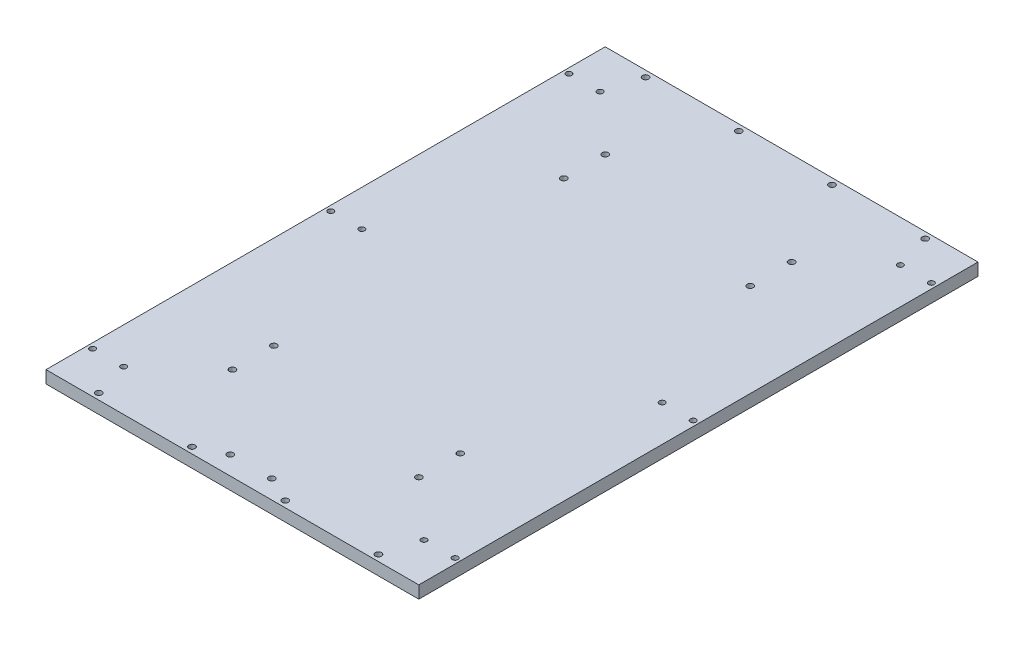
ISO-10303-21;
HEADER;
FILE_DESCRIPTION(('STEP AP214'),'2;1');
FILE_NAME('part.step','',(''),(''),'','','');
FILE_SCHEMA(('AUTOMOTIVE_DESIGN { 1 0 10303 214 1 1 1 1 }'));
ENDSEC;
DATA;
#1=APPLICATION_CONTEXT('core data for automotive mechanical design processes');
#2=APPLICATION_PROTOCOL_DEFINITION('international standard','automotive_design',2000,#1);
#3=PRODUCT_CONTEXT('',#1,'mechanical');
#4=PRODUCT('Part','Part','',(#3));
#5=PRODUCT_RELATED_PRODUCT_CATEGORY('part','',(#4));
#6=PRODUCT_DEFINITION_FORMATION('','',#4);
#7=PRODUCT_DEFINITION_CONTEXT('part definition',#1,'design');
#8=PRODUCT_DEFINITION('design','',#6,#7);
#9=PRODUCT_DEFINITION_SHAPE('','',#8);
#10=(LENGTH_UNIT() NAMED_UNIT(*) SI_UNIT(.MILLI.,.METRE.));
#11=(NAMED_UNIT(*) PLANE_ANGLE_UNIT() SI_UNIT($,.RADIAN.));
#12=(NAMED_UNIT(*) SI_UNIT($,.STERADIAN.) SOLID_ANGLE_UNIT());
#13=UNCERTAINTY_MEASURE_WITH_UNIT(LENGTH_MEASURE(1.E-05),#10,'distance_accuracy_value','');
#14=(GEOMETRIC_REPRESENTATION_CONTEXT(3) GLOBAL_UNCERTAINTY_ASSIGNED_CONTEXT((#13)) GLOBAL_UNIT_ASSIGNED_CONTEXT((#10,
#11,#12)) REPRESENTATION_CONTEXT('',''));
#15=CARTESIAN_POINT('',(0.,0.,0.));
#16=DIRECTION('',(0.,0.,1.));
#17=DIRECTION('',(1.,0.,0.));
#18=AXIS2_PLACEMENT_3D('',#15,#16,#17);
#19=CARTESIAN_POINT('',(180.,12.,-270.));
#20=DIRECTION('',(0.,-1.,0.));
#21=DIRECTION('',(0.,0.,-1.));
#22=AXIS2_PLACEMENT_3D('',#19,#20,#21);
#23=PLANE('',#22);
#24=CARTESIAN_POINT('',(90.,12.,-180.));
#25=DIRECTION('',(0.,-1.,0.));
#26=DIRECTION('',(0.,0.,1.));
#27=AXIS2_PLACEMENT_3D('',#24,#25,#26);
#28=CIRCLE('',#27,3.00000000000001);
#29=CARTESIAN_POINT('',(90.,12.,-177.));
#30=VERTEX_POINT('',#29);
#31=EDGE_CURVE('E168',#30,#30,#28,.T.);
#32=ORIENTED_EDGE('',*,*,#31,.T.);
#33=EDGE_LOOP('',(#32));
#34=FACE_BOUND('',#33,.T.);
#35=CARTESIAN_POINT('',(90.,12.,140.));
#36=DIRECTION('',(0.,1.,0.));
#37=DIRECTION('',(0.,0.,-1.));
#38=AXIS2_PLACEMENT_3D('',#35,#36,#37);
#39=CIRCLE('',#38,3.00000000000001);
#40=CARTESIAN_POINT('',(90.,12.,137.));
#41=VERTEX_POINT('',#40);
#42=EDGE_CURVE('E177',#41,#41,#39,.T.);
#43=ORIENTED_EDGE('',*,*,#42,.F.);
#44=EDGE_LOOP('',(#43));
#45=FACE_BOUND('',#44,.T.);
#46=CARTESIAN_POINT('',(90.,12.,180.));
#47=DIRECTION('',(0.,1.,0.));
#48=DIRECTION('',(0.,0.,-1.));
#49=AXIS2_PLACEMENT_3D('',#46,#47,#48);
#50=CIRCLE('',#49,3.00000000000001);
#51=CARTESIAN_POINT('',(90.,12.,177.));
#52=VERTEX_POINT('',#51);
#53=EDGE_CURVE('E183',#52,#52,#50,.T.);
#54=ORIENTED_EDGE('',*,*,#53,.F.);
#55=EDGE_LOOP('',(#54));
#56=FACE_BOUND('',#55,.T.);
#57=CARTESIAN_POINT('',(-90.,12.,180.));
#58=DIRECTION('',(0.,-1.,0.));
#59=DIRECTION('',(0.,0.,-1.));
#60=AXIS2_PLACEMENT_3D('',#57,#58,#59);
#61=CIRCLE('',#60,3.00000000000001);
#62=CARTESIAN_POINT('',(-90.,12.,177.));
#63=VERTEX_POINT('',#62);
#64=EDGE_CURVE('E192',#63,#63,#61,.T.);
#65=ORIENTED_EDGE('',*,*,#64,.T.);
#66=EDGE_LOOP('',(#65));
#67=FACE_BOUND('',#66,.T.);
#68=CARTESIAN_POINT('',(-90.,12.,-140.));
#69=DIRECTION('',(0.,1.,0.));
#70=DIRECTION('',(0.,0.,1.));
#71=AXIS2_PLACEMENT_3D('',#68,#69,#70);
#72=CIRCLE('',#71,3.00000000000001);
#73=CARTESIAN_POINT('',(-90.,12.,-137.));
#74=VERTEX_POINT('',#73);
#75=EDGE_CURVE('E199',#74,#74,#72,.T.);
#76=ORIENTED_EDGE('',*,*,#75,.F.);
#77=EDGE_LOOP('',(#76));
#78=FACE_BOUND('',#77,.T.);
#79=CARTESIAN_POINT('',(-90.,12.,-180.));
#80=DIRECTION('',(0.,1.,0.));
#81=DIRECTION('',(0.,0.,1.));
#82=AXIS2_PLACEMENT_3D('',#79,#80,#81);
#83=CIRCLE('',#82,3.00000000000001);
#84=CARTESIAN_POINT('',(-90.,12.,-177.));
#85=VERTEX_POINT('',#84);
#86=EDGE_CURVE('E205',#85,#85,#83,.T.);
#87=ORIENTED_EDGE('',*,*,#86,.F.);
#88=EDGE_LOOP('',(#87));
#89=FACE_BOUND('',#88,.T.);
#90=CARTESIAN_POINT('',(175.,12.,230.));
#91=DIRECTION('',(0.,-1.,0.));
#92=DIRECTION('',(0.,0.,1.));
#93=AXIS2_PLACEMENT_3D('',#90,#91,#92);
#94=CIRCLE('',#93,2.75000000000001);
#95=CARTESIAN_POINT('',(175.,12.,232.75));
#96=VERTEX_POINT('',#95);
#97=EDGE_CURVE('E214',#96,#96,#94,.T.);
#98=ORIENTED_EDGE('',*,*,#97,.T.);
#99=EDGE_LOOP('',(#98));
#100=FACE_BOUND('',#99,.T.);
#101=CARTESIAN_POINT('',(175.,12.,0.));
#102=DIRECTION('',(0.,-1.,0.));
#103=DIRECTION('',(0.,0.,1.));
#104=AXIS2_PLACEMENT_3D('',#101,#102,#103);
#105=CIRCLE('',#104,2.75000000000001);
#106=CARTESIAN_POINT('',(175.,12.,2.75000000000001));
#107=VERTEX_POINT('',#106);
#108=EDGE_CURVE('E224',#107,#107,#105,.T.);
#109=ORIENTED_EDGE('',*,*,#108,.T.);
#110=EDGE_LOOP('',(#109));
#111=FACE_BOUND('',#110,.T.);
#112=CARTESIAN_POINT('',(175.,12.,-230.));
#113=DIRECTION('',(0.,-1.,0.));
#114=DIRECTION('',(0.,0.,1.));
#115=AXIS2_PLACEMENT_3D('',#112,#113,#114);
#116=CIRCLE('',#115,2.75000000000001);
#117=CARTESIAN_POINT('',(175.,12.,-227.25));
#118=VERTEX_POINT('',#117);
#119=EDGE_CURVE('E234',#118,#118,#116,.T.);
#120=ORIENTED_EDGE('',*,*,#119,.T.);
#121=EDGE_LOOP('',(#120));
#122=FACE_BOUND('',#121,.T.);
#123=CARTESIAN_POINT('',(-175.,12.,0.));
#124=DIRECTION('',(0.,1.,0.));
#125=DIRECTION('',(0.,0.,1.));
#126=AXIS2_PLACEMENT_3D('',#123,#124,#125);
#127=CIRCLE('',#126,2.75000000000001);
#128=CARTESIAN_POINT('',(-175.,12.,2.75000000000001));
#129=VERTEX_POINT('',#128);
#130=EDGE_CURVE('E243',#129,#129,#127,.T.);
#131=ORIENTED_EDGE('',*,*,#130,.F.);
#132=EDGE_LOOP('',(#131));
#133=FACE_BOUND('',#132,.T.);
#134=CARTESIAN_POINT('',(-145.,12.,0.));
#135=DIRECTION('',(0.,1.,0.));
#136=DIRECTION('',(0.,0.,1.));
#137=AXIS2_PLACEMENT_3D('',#134,#135,#136);
#138=CIRCLE('',#137,2.75000000000001);
#139=CARTESIAN_POINT('',(-145.,12.,2.75000000000001));
#140=VERTEX_POINT('',#139);
#141=EDGE_CURVE('E249',#140,#140,#138,.T.);
#142=ORIENTED_EDGE('',*,*,#141,.F.);
#143=EDGE_LOOP('',(#142));
#144=FACE_BOUND('',#143,.T.);
#145=CARTESIAN_POINT('',(-145.,12.,-230.));
#146=DIRECTION('',(0.,1.,0.));
#147=DIRECTION('',(0.,0.,1.));
#148=AXIS2_PLACEMENT_3D('',#145,#146,#147);
#149=CIRCLE('',#148,2.75000000000001);
#150=CARTESIAN_POINT('',(-145.,12.,-227.25));
#151=VERTEX_POINT('',#150);
#152=EDGE_CURVE('E253',#151,#151,#149,.T.);
#153=ORIENTED_EDGE('',*,*,#152,.F.);
#154=EDGE_LOOP('',(#153));
#155=FACE_BOUND('',#154,.T.);
#156=CARTESIAN_POINT('',(-175.,12.,-230.));
#157=DIRECTION('',(0.,1.,0.));
#158=DIRECTION('',(0.,0.,1.));
#159=AXIS2_PLACEMENT_3D('',#156,#157,#158);
#160=CIRCLE('',#159,2.75000000000001);
#161=CARTESIAN_POINT('',(-175.,12.,-227.25));
#162=VERTEX_POINT('',#161);
#163=EDGE_CURVE('E259',#162,#162,#160,.T.);
#164=ORIENTED_EDGE('',*,*,#163,.F.);
#165=EDGE_LOOP('',(#164));
#166=FACE_BOUND('',#165,.T.);
#167=CARTESIAN_POINT('',(-45.,12.,-264.));
#168=DIRECTION('',(0.,-1.,0.));
#169=DIRECTION('',(0.,0.,-1.));
#170=AXIS2_PLACEMENT_3D('',#167,#168,#169);
#171=CIRCLE('',#170,2.99999999999999);
#172=CARTESIAN_POINT('',(-45.,12.,-267.));
#173=VERTEX_POINT('',#172);
#174=EDGE_CURVE('E268',#173,#173,#171,.T.);
#175=ORIENTED_EDGE('',*,*,#174,.T.);
#176=EDGE_LOOP('',(#175));
#177=FACE_BOUND('',#176,.T.);
#178=CARTESIAN_POINT('',(135.,12.,-264.));
#179=DIRECTION('',(0.,-1.,0.));
#180=DIRECTION('',(0.,0.,-1.));
#181=AXIS2_PLACEMENT_3D('',#178,#179,#180);
#182=CIRCLE('',#181,2.99999999999999);
#183=CARTESIAN_POINT('',(135.,12.,-267.));
#184=VERTEX_POINT('',#183);
#185=EDGE_CURVE('E280',#184,#184,#182,.T.);
#186=ORIENTED_EDGE('',*,*,#185,.T.);
#187=EDGE_LOOP('',(#186));
#188=FACE_BOUND('',#187,.T.);
#189=CARTESIAN_POINT('',(45.,12.,264.));
#190=DIRECTION('',(0.,-1.,0.));
#191=DIRECTION('',(0.,0.,-1.));
#192=AXIS2_PLACEMENT_3D('',#189,#190,#191);
#193=CIRCLE('',#192,2.99999999999999);
#194=CARTESIAN_POINT('',(45.,12.,261.));
#195=VERTEX_POINT('',#194);
#196=EDGE_CURVE('E291',#195,#195,#193,.F.);
#197=ORIENTED_EDGE('',*,*,#196,.F.);
#198=EDGE_LOOP('',(#197));
#199=FACE_BOUND('',#198,.T.);
#200=CARTESIAN_POINT('',(135.,12.,264.));
#201=DIRECTION('',(0.,-1.,0.));
#202=DIRECTION('',(0.,0.,-1.));
#203=AXIS2_PLACEMENT_3D('',#200,#201,#202);
#204=CIRCLE('',#203,2.99999999999999);
#205=CARTESIAN_POINT('',(135.,12.,261.));
#206=VERTEX_POINT('',#205);
#207=EDGE_CURVE('E297',#206,#206,#204,.F.);
#208=ORIENTED_EDGE('',*,*,#207,.F.);
#209=EDGE_LOOP('',(#208));
#210=FACE_BOUND('',#209,.T.);
#211=CARTESIAN_POINT('',(20.,12.,252.));
#212=DIRECTION('',(0.,-1.,0.));
#213=DIRECTION('',(0.,0.,-1.));
#214=AXIS2_PLACEMENT_3D('',#211,#212,#213);
#215=CIRCLE('',#214,3.00000000000001);
#216=CARTESIAN_POINT('',(20.,12.,249.));
#217=VERTEX_POINT('',#216);
#218=EDGE_CURVE('E303',#217,#217,#215,.F.);
#219=ORIENTED_EDGE('',*,*,#218,.F.);
#220=EDGE_LOOP('',(#219));
#221=FACE_BOUND('',#220,.T.);
#222=CARTESIAN_POINT('',(-20.,12.,252.));
#223=DIRECTION('',(0.,-1.,0.));
#224=DIRECTION('',(0.,0.,-1.));
#225=AXIS2_PLACEMENT_3D('',#222,#223,#224);
#226=CIRCLE('',#225,3.);
#227=CARTESIAN_POINT('',(-20.,12.,249.));
#228=VERTEX_POINT('',#227);
#229=EDGE_CURVE('E105',#228,#228,#226,.F.);
#230=ORIENTED_EDGE('',*,*,#229,.F.);
#231=EDGE_LOOP('',(#230));
#232=FACE_BOUND('',#231,.T.);
#233=DIRECTION('',(0.,0.,-1.));
#234=VECTOR('',#233,1.);
#235=CARTESIAN_POINT('',(180.,12.,270.));
#236=LINE('',#235,#234);
#237=CARTESIAN_POINT('',(180.,12.,270.));
#238=VERTEX_POINT('',#237);
#239=CARTESIAN_POINT('',(180.,12.,-270.));
#240=VERTEX_POINT('',#239);
#241=EDGE_CURVE('E87',#238,#240,#236,.T.);
#242=ORIENTED_EDGE('',*,*,#241,.T.);
#243=DIRECTION('',(-1.,0.,0.));
#244=VECTOR('',#243,1.);
#245=CARTESIAN_POINT('',(-180.,12.,-270.));
#246=LINE('',#245,#244);
#247=CARTESIAN_POINT('',(-180.,12.,-270.));
#248=VERTEX_POINT('',#247);
#249=EDGE_CURVE('E82',#240,#248,#246,.T.);
#250=ORIENTED_EDGE('',*,*,#249,.T.);
#251=DIRECTION('',(0.,0.,1.));
#252=VECTOR('',#251,1.);
#253=CARTESIAN_POINT('',(-180.,12.,270.));
#254=LINE('',#253,#252);
#255=CARTESIAN_POINT('',(-180.,12.,270.));
#256=VERTEX_POINT('',#255);
#257=EDGE_CURVE('E85',#248,#256,#254,.T.);
#258=ORIENTED_EDGE('',*,*,#257,.T.);
#259=DIRECTION('',(1.,0.,0.));
#260=VECTOR('',#259,1.);
#261=CARTESIAN_POINT('',(-180.,12.,270.));
#262=LINE('',#261,#260);
#263=EDGE_CURVE('E51',#256,#238,#262,.T.);
#264=ORIENTED_EDGE('',*,*,#263,.T.);
#265=EDGE_LOOP('',(#242,#250,#258,#264));
#266=FACE_BOUND('',#265,.T.);
#267=CARTESIAN_POINT('',(-45.,12.,264.));
#268=DIRECTION('',(0.,-1.,0.));
#269=DIRECTION('',(0.,0.,-1.));
#270=AXIS2_PLACEMENT_3D('',#267,#268,#269);
#271=CIRCLE('',#270,2.99999999999999);
#272=CARTESIAN_POINT('',(-45.,12.,261.));
#273=VERTEX_POINT('',#272);
#274=EDGE_CURVE('E115',#273,#273,#271,.F.);
#275=ORIENTED_EDGE('',*,*,#274,.F.);
#276=EDGE_LOOP('',(#275));
#277=FACE_BOUND('',#276,.T.);
#278=CARTESIAN_POINT('',(-135.,12.,264.));
#279=DIRECTION('',(0.,-1.,0.));
#280=DIRECTION('',(0.,0.,-1.));
#281=AXIS2_PLACEMENT_3D('',#278,#279,#280);
#282=CIRCLE('',#281,2.99999999999999);
#283=CARTESIAN_POINT('',(-135.,12.,261.));
#284=VERTEX_POINT('',#283);
#285=EDGE_CURVE('E121',#284,#284,#282,.F.);
#286=ORIENTED_EDGE('',*,*,#285,.F.);
#287=EDGE_LOOP('',(#286));
#288=FACE_BOUND('',#287,.T.);
#289=CARTESIAN_POINT('',(45.,12.,-264.));
#290=DIRECTION('',(0.,-1.,0.));
#291=DIRECTION('',(0.,0.,-1.));
#292=AXIS2_PLACEMENT_3D('',#289,#290,#291);
#293=CIRCLE('',#292,2.99999999999999);
#294=CARTESIAN_POINT('',(45.,12.,-267.));
#295=VERTEX_POINT('',#294);
#296=EDGE_CURVE('E274',#295,#295,#293,.T.);
#297=ORIENTED_EDGE('',*,*,#296,.T.);
#298=EDGE_LOOP('',(#297));
#299=FACE_BOUND('',#298,.T.);
#300=CARTESIAN_POINT('',(-135.,12.,-264.));
#301=DIRECTION('',(0.,-1.,0.));
#302=DIRECTION('',(0.,0.,-1.));
#303=AXIS2_PLACEMENT_3D('',#300,#301,#302);
#304=CIRCLE('',#303,2.99999999999999);
#305=CARTESIAN_POINT('',(-135.,12.,-267.));
#306=VERTEX_POINT('',#305);
#307=EDGE_CURVE('E262',#306,#306,#304,.T.);
#308=ORIENTED_EDGE('',*,*,#307,.T.);
#309=EDGE_LOOP('',(#308));
#310=FACE_BOUND('',#309,.T.);
#311=CARTESIAN_POINT('',(-145.,12.,230.));
#312=DIRECTION('',(0.,1.,0.));
#313=DIRECTION('',(0.,0.,1.));
#314=AXIS2_PLACEMENT_3D('',#311,#312,#313);
#315=CIRCLE('',#314,2.75000000000001);
#316=CARTESIAN_POINT('',(-145.,12.,232.75));
#317=VERTEX_POINT('',#316);
#318=EDGE_CURVE('E127',#317,#317,#315,.T.);
#319=ORIENTED_EDGE('',*,*,#318,.F.);
#320=EDGE_LOOP('',(#319));
#321=FACE_BOUND('',#320,.T.);
#322=CARTESIAN_POINT('',(-175.,12.,230.));
#323=DIRECTION('',(0.,1.,0.));
#324=DIRECTION('',(0.,0.,1.));
#325=AXIS2_PLACEMENT_3D('',#322,#323,#324);
#326=CIRCLE('',#325,2.75000000000001);
#327=CARTESIAN_POINT('',(-175.,12.,232.75));
#328=VERTEX_POINT('',#327);
#329=EDGE_CURVE('E11',#328,#328,#326,.T.);
#330=ORIENTED_EDGE('',*,*,#329,.F.);
#331=EDGE_LOOP('',(#330));
#332=FACE_BOUND('',#331,.T.);
#333=CARTESIAN_POINT('',(145.,12.,-230.));
#334=DIRECTION('',(0.,-1.,0.));
#335=DIRECTION('',(0.,0.,1.));
#336=AXIS2_PLACEMENT_3D('',#333,#334,#335);
#337=CIRCLE('',#336,2.75000000000001);
#338=CARTESIAN_POINT('',(145.,12.,-227.25));
#339=VERTEX_POINT('',#338);
#340=EDGE_CURVE('E148',#339,#339,#337,.T.);
#341=ORIENTED_EDGE('',*,*,#340,.T.);
#342=EDGE_LOOP('',(#341));
#343=FACE_BOUND('',#342,.T.);
#344=CARTESIAN_POINT('',(145.,12.,0.));
#345=DIRECTION('',(0.,-1.,0.));
#346=DIRECTION('',(0.,0.,1.));
#347=AXIS2_PLACEMENT_3D('',#344,#345,#346);
#348=CIRCLE('',#347,2.75000000000001);
#349=CARTESIAN_POINT('',(145.,12.,2.75000000000001));
#350=VERTEX_POINT('',#349);
#351=EDGE_CURVE('E152',#350,#350,#348,.T.);
#352=ORIENTED_EDGE('',*,*,#351,.T.);
#353=EDGE_LOOP('',(#352));
#354=FACE_BOUND('',#353,.T.);
#355=CARTESIAN_POINT('',(145.,12.,230.));
#356=DIRECTION('',(0.,-1.,0.));
#357=DIRECTION('',(0.,0.,1.));
#358=AXIS2_PLACEMENT_3D('',#355,#356,#357);
#359=CIRCLE('',#358,2.75000000000001);
#360=CARTESIAN_POINT('',(145.,12.,232.75));
#361=VERTEX_POINT('',#360);
#362=EDGE_CURVE('E156',#361,#361,#359,.T.);
#363=ORIENTED_EDGE('',*,*,#362,.T.);
#364=EDGE_LOOP('',(#363));
#365=FACE_BOUND('',#364,.T.);
#366=CARTESIAN_POINT('',(-90.,12.,140.));
#367=DIRECTION('',(0.,-1.,0.));
#368=DIRECTION('',(0.,0.,-1.));
#369=AXIS2_PLACEMENT_3D('',#366,#367,#368);
#370=CIRCLE('',#369,3.00000000000001);
#371=CARTESIAN_POINT('',(-90.,12.,137.));
#372=VERTEX_POINT('',#371);
#373=EDGE_CURVE('E160',#372,#372,#370,.T.);
#374=ORIENTED_EDGE('',*,*,#373,.T.);
#375=EDGE_LOOP('',(#374));
#376=FACE_BOUND('',#375,.T.);
#377=CARTESIAN_POINT('',(90.,12.,-140.));
#378=DIRECTION('',(0.,-1.,0.));
#379=DIRECTION('',(0.,0.,1.));
#380=AXIS2_PLACEMENT_3D('',#377,#378,#379);
#381=CIRCLE('',#380,3.00000000000001);
#382=CARTESIAN_POINT('',(90.,12.,-137.));
#383=VERTEX_POINT('',#382);
#384=EDGE_CURVE('E163',#383,#383,#381,.T.);
#385=ORIENTED_EDGE('',*,*,#384,.T.);
#386=EDGE_LOOP('',(#385));
#387=FACE_BOUND('',#386,.T.);
#388=ADVANCED_FACE('F34',(#34,#45,#56,#67,#78,#89,#100,#111,#122,#133,#144,#155,#166,#177,#188,
#199,#210,#221,#232,#266,#277,#288,#299,#310,#321,#332,#343,#354,#365,#376,#387),#23,.F.);
#389=CARTESIAN_POINT('',(180.,0.,-270.));
#390=DIRECTION('',(0.,-1.,0.));
#391=DIRECTION('',(0.,0.,-1.));
#392=AXIS2_PLACEMENT_3D('',#389,#390,#391);
#393=PLANE('',#392);
#394=CARTESIAN_POINT('',(90.,0.,-180.));
#395=DIRECTION('',(0.,-1.,0.));
#396=DIRECTION('',(0.,0.,-1.));
#397=AXIS2_PLACEMENT_3D('',#394,#395,#396);
#398=CIRCLE('',#397,3.00000000000001);
#399=CARTESIAN_POINT('',(90.,0.,-183.));
#400=VERTEX_POINT('',#399);
#401=EDGE_CURVE('E173',#400,#400,#398,.T.);
#402=ORIENTED_EDGE('',*,*,#401,.F.);
#403=EDGE_LOOP('',(#402));
#404=FACE_BOUND('',#403,.T.);
#405=CARTESIAN_POINT('',(90.,0.,140.));
#406=DIRECTION('',(0.,-1.,0.));
#407=DIRECTION('',(0.,0.,-1.));
#408=AXIS2_PLACEMENT_3D('',#405,#406,#407);
#409=CIRCLE('',#408,3.00000000000001);
#410=CARTESIAN_POINT('',(90.,0.,137.));
#411=VERTEX_POINT('',#410);
#412=EDGE_CURVE('E176',#411,#411,#409,.F.);
#413=ORIENTED_EDGE('',*,*,#412,.T.);
#414=EDGE_LOOP('',(#413));
#415=FACE_BOUND('',#414,.T.);
#416=CARTESIAN_POINT('',(90.,0.,180.));
#417=DIRECTION('',(0.,-1.,0.));
#418=DIRECTION('',(0.,0.,-1.));
#419=AXIS2_PLACEMENT_3D('',#416,#417,#418);
#420=CIRCLE('',#419,3.00000000000001);
#421=CARTESIAN_POINT('',(90.,0.,177.));
#422=VERTEX_POINT('',#421);
#423=EDGE_CURVE('E180',#422,#422,#420,.F.);
#424=ORIENTED_EDGE('',*,*,#423,.T.);
#425=EDGE_LOOP('',(#424));
#426=FACE_BOUND('',#425,.T.);
#427=CARTESIAN_POINT('',(-90.,0.,180.));
#428=DIRECTION('',(0.,-1.,0.));
#429=DIRECTION('',(0.,0.,-1.));
#430=AXIS2_PLACEMENT_3D('',#427,#428,#429);
#431=CIRCLE('',#430,3.00000000000001);
#432=CARTESIAN_POINT('',(-90.,0.,177.));
#433=VERTEX_POINT('',#432);
#434=EDGE_CURVE('E195',#433,#433,#431,.T.);
#435=ORIENTED_EDGE('',*,*,#434,.F.);
#436=EDGE_LOOP('',(#435));
#437=FACE_BOUND('',#436,.T.);
#438=CARTESIAN_POINT('',(-90.,0.,-140.));
#439=DIRECTION('',(0.,-1.,0.));
#440=DIRECTION('',(0.,0.,-1.));
#441=AXIS2_PLACEMENT_3D('',#438,#439,#440);
#442=CIRCLE('',#441,3.00000000000001);
#443=CARTESIAN_POINT('',(-90.,0.,-143.));
#444=VERTEX_POINT('',#443);
#445=EDGE_CURVE('E198',#444,#444,#442,.F.);
#446=ORIENTED_EDGE('',*,*,#445,.T.);
#447=EDGE_LOOP('',(#446));
#448=FACE_BOUND('',#447,.T.);
#449=CARTESIAN_POINT('',(-90.,0.,-180.));
#450=DIRECTION('',(0.,-1.,0.));
#451=DIRECTION('',(0.,0.,-1.));
#452=AXIS2_PLACEMENT_3D('',#449,#450,#451);
#453=CIRCLE('',#452,3.00000000000001);
#454=CARTESIAN_POINT('',(-90.,0.,-183.));
#455=VERTEX_POINT('',#454);
#456=EDGE_CURVE('E202',#455,#455,#453,.F.);
#457=ORIENTED_EDGE('',*,*,#456,.T.);
#458=EDGE_LOOP('',(#457));
#459=FACE_BOUND('',#458,.T.);
#460=CARTESIAN_POINT('',(175.,0.,230.));
#461=DIRECTION('',(0.,-1.,0.));
#462=DIRECTION('',(0.,0.,-1.));
#463=AXIS2_PLACEMENT_3D('',#460,#461,#462);
#464=CIRCLE('',#463,2.75000000000001);
#465=CARTESIAN_POINT('',(175.,0.,227.25));
#466=VERTEX_POINT('',#465);
#467=EDGE_CURVE('E217',#466,#466,#464,.T.);
#468=ORIENTED_EDGE('',*,*,#467,.F.);
#469=EDGE_LOOP('',(#468));
#470=FACE_BOUND('',#469,.T.);
#471=CARTESIAN_POINT('',(175.,0.,0.));
#472=DIRECTION('',(0.,-1.,0.));
#473=DIRECTION('',(0.,0.,-1.));
#474=AXIS2_PLACEMENT_3D('',#471,#472,#473);
#475=CIRCLE('',#474,2.75000000000001);
#476=CARTESIAN_POINT('',(175.,0.,-2.75000000000001));
#477=VERTEX_POINT('',#476);
#478=EDGE_CURVE('E227',#477,#477,#475,.T.);
#479=ORIENTED_EDGE('',*,*,#478,.F.);
#480=EDGE_LOOP('',(#479));
#481=FACE_BOUND('',#480,.T.);
#482=CARTESIAN_POINT('',(175.,0.,-230.));
#483=DIRECTION('',(0.,-1.,0.));
#484=DIRECTION('',(0.,0.,-1.));
#485=AXIS2_PLACEMENT_3D('',#482,#483,#484);
#486=CIRCLE('',#485,2.75000000000001);
#487=CARTESIAN_POINT('',(175.,0.,-232.75));
#488=VERTEX_POINT('',#487);
#489=EDGE_CURVE('E237',#488,#488,#486,.T.);
#490=ORIENTED_EDGE('',*,*,#489,.F.);
#491=EDGE_LOOP('',(#490));
#492=FACE_BOUND('',#491,.T.);
#493=CARTESIAN_POINT('',(-175.,0.,0.));
#494=DIRECTION('',(0.,-1.,0.));
#495=DIRECTION('',(0.,0.,-1.));
#496=AXIS2_PLACEMENT_3D('',#493,#494,#495);
#497=CIRCLE('',#496,2.75000000000001);
#498=CARTESIAN_POINT('',(-175.,0.,-2.75000000000001));
#499=VERTEX_POINT('',#498);
#500=EDGE_CURVE('E240',#499,#499,#497,.F.);
#501=ORIENTED_EDGE('',*,*,#500,.T.);
#502=EDGE_LOOP('',(#501));
#503=FACE_BOUND('',#502,.T.);
#504=CARTESIAN_POINT('',(-145.,0.,0.));
#505=DIRECTION('',(0.,-1.,0.));
#506=DIRECTION('',(0.,0.,-1.));
#507=AXIS2_PLACEMENT_3D('',#504,#505,#506);
#508=CIRCLE('',#507,2.75000000000001);
#509=CARTESIAN_POINT('',(-145.,0.,-2.75000000000001));
#510=VERTEX_POINT('',#509);
#511=EDGE_CURVE('E246',#510,#510,#508,.F.);
#512=ORIENTED_EDGE('',*,*,#511,.T.);
#513=EDGE_LOOP('',(#512));
#514=FACE_BOUND('',#513,.T.);
#515=CARTESIAN_POINT('',(-145.,0.,-230.));
#516=DIRECTION('',(0.,-1.,0.));
#517=DIRECTION('',(0.,0.,-1.));
#518=AXIS2_PLACEMENT_3D('',#515,#516,#517);
#519=CIRCLE('',#518,2.75000000000001);
#520=CARTESIAN_POINT('',(-145.,0.,-232.75));
#521=VERTEX_POINT('',#520);
#522=EDGE_CURVE('E252',#521,#521,#519,.F.);
#523=ORIENTED_EDGE('',*,*,#522,.T.);
#524=EDGE_LOOP('',(#523));
#525=FACE_BOUND('',#524,.T.);
#526=CARTESIAN_POINT('',(-175.,0.,-230.));
#527=DIRECTION('',(0.,-1.,0.));
#528=DIRECTION('',(0.,0.,-1.));
#529=AXIS2_PLACEMENT_3D('',#526,#527,#528);
#530=CIRCLE('',#529,2.75000000000001);
#531=CARTESIAN_POINT('',(-175.,0.,-232.75));
#532=VERTEX_POINT('',#531);
#533=EDGE_CURVE('E256',#532,#532,#530,.F.);
#534=ORIENTED_EDGE('',*,*,#533,.T.);
#535=EDGE_LOOP('',(#534));
#536=FACE_BOUND('',#535,.T.);
#537=CARTESIAN_POINT('',(-45.,0.,-264.));
#538=DIRECTION('',(0.,1.,0.));
#539=DIRECTION('',(0.,0.,1.));
#540=AXIS2_PLACEMENT_3D('',#537,#538,#539);
#541=CIRCLE('',#540,2.99999999999999);
#542=CARTESIAN_POINT('',(-45.,0.,-261.));
#543=VERTEX_POINT('',#542);
#544=EDGE_CURVE('E271',#543,#543,#541,.T.);
#545=ORIENTED_EDGE('',*,*,#544,.T.);
#546=EDGE_LOOP('',(#545));
#547=FACE_BOUND('',#546,.T.);
#548=CARTESIAN_POINT('',(135.,0.,-264.));
#549=DIRECTION('',(0.,1.,0.));
#550=DIRECTION('',(0.,0.,1.));
#551=AXIS2_PLACEMENT_3D('',#548,#549,#550);
#552=CIRCLE('',#551,2.99999999999999);
#553=CARTESIAN_POINT('',(135.,0.,-261.));
#554=VERTEX_POINT('',#553);
#555=EDGE_CURVE('E283',#554,#554,#552,.T.);
#556=ORIENTED_EDGE('',*,*,#555,.T.);
#557=EDGE_LOOP('',(#556));
#558=FACE_BOUND('',#557,.T.);
#559=CARTESIAN_POINT('',(45.,0.,264.));
#560=DIRECTION('',(0.,-1.,0.));
#561=DIRECTION('',(0.,0.,-1.));
#562=AXIS2_PLACEMENT_3D('',#559,#560,#561);
#563=CIRCLE('',#562,2.99999999999999);
#564=CARTESIAN_POINT('',(45.,0.,261.));
#565=VERTEX_POINT('',#564);
#566=EDGE_CURVE('E286',#565,#565,#563,.T.);
#567=ORIENTED_EDGE('',*,*,#566,.F.);
#568=EDGE_LOOP('',(#567));
#569=FACE_BOUND('',#568,.T.);
#570=CARTESIAN_POINT('',(135.,0.,264.));
#571=DIRECTION('',(0.,-1.,0.));
#572=DIRECTION('',(0.,0.,-1.));
#573=AXIS2_PLACEMENT_3D('',#570,#571,#572);
#574=CIRCLE('',#573,2.99999999999999);
#575=CARTESIAN_POINT('',(135.,0.,261.));
#576=VERTEX_POINT('',#575);
#577=EDGE_CURVE('E294',#576,#576,#574,.T.);
#578=ORIENTED_EDGE('',*,*,#577,.F.);
#579=EDGE_LOOP('',(#578));
#580=FACE_BOUND('',#579,.T.);
#581=CARTESIAN_POINT('',(20.,0.,252.));
#582=DIRECTION('',(0.,-1.,0.));
#583=DIRECTION('',(0.,0.,-1.));
#584=AXIS2_PLACEMENT_3D('',#581,#582,#583);
#585=CIRCLE('',#584,3.00000000000001);
#586=CARTESIAN_POINT('',(20.,0.,249.));
#587=VERTEX_POINT('',#586);
#588=EDGE_CURVE('E300',#587,#587,#585,.T.);
#589=ORIENTED_EDGE('',*,*,#588,.F.);
#590=EDGE_LOOP('',(#589));
#591=FACE_BOUND('',#590,.T.);
#592=CARTESIAN_POINT('',(-20.,0.,252.));
#593=DIRECTION('',(0.,-1.,0.));
#594=DIRECTION('',(0.,0.,-1.));
#595=AXIS2_PLACEMENT_3D('',#592,#593,#594);
#596=CIRCLE('',#595,3.);
#597=CARTESIAN_POINT('',(-20.,0.,249.));
#598=VERTEX_POINT('',#597);
#599=EDGE_CURVE('E306',#598,#598,#596,.T.);
#600=ORIENTED_EDGE('',*,*,#599,.F.);
#601=EDGE_LOOP('',(#600));
#602=FACE_BOUND('',#601,.T.);
#603=DIRECTION('',(0.,0.,-1.));
#604=VECTOR('',#603,1.);
#605=CARTESIAN_POINT('',(180.,0.,270.));
#606=LINE('',#605,#604);
#607=CARTESIAN_POINT('',(180.,0.,270.));
#608=VERTEX_POINT('',#607);
#609=CARTESIAN_POINT('',(180.,0.,-270.));
#610=VERTEX_POINT('',#609);
#611=EDGE_CURVE('E102',#608,#610,#606,.T.);
#612=ORIENTED_EDGE('',*,*,#611,.F.);
#613=DIRECTION('',(1.,0.,0.));
#614=VECTOR('',#613,1.);
#615=CARTESIAN_POINT('',(-180.,0.,270.));
#616=LINE('',#615,#614);
#617=CARTESIAN_POINT('',(-180.,0.,270.));
#618=VERTEX_POINT('',#617);
#619=EDGE_CURVE('E74',#618,#608,#616,.T.);
#620=ORIENTED_EDGE('',*,*,#619,.F.);
#621=DIRECTION('',(0.,0.,1.));
#622=VECTOR('',#621,1.);
#623=CARTESIAN_POINT('',(-180.,0.,270.));
#624=LINE('',#623,#622);
#625=CARTESIAN_POINT('',(-180.,0.,-270.));
#626=VERTEX_POINT('',#625);
#627=EDGE_CURVE('E68',#626,#618,#624,.T.);
#628=ORIENTED_EDGE('',*,*,#627,.F.);
#629=DIRECTION('',(-1.,0.,0.));
#630=VECTOR('',#629,1.);
#631=CARTESIAN_POINT('',(-180.,0.,-270.));
#632=LINE('',#631,#630);
#633=EDGE_CURVE('E92',#610,#626,#632,.T.);
#634=ORIENTED_EDGE('',*,*,#633,.F.);
#635=EDGE_LOOP('',(#612,#620,#628,#634));
#636=FACE_BOUND('',#635,.T.);
#637=CARTESIAN_POINT('',(-45.,0.,264.));
#638=DIRECTION('',(0.,-1.,0.));
#639=DIRECTION('',(0.,0.,-1.));
#640=AXIS2_PLACEMENT_3D('',#637,#638,#639);
#641=CIRCLE('',#640,2.99999999999999);
#642=CARTESIAN_POINT('',(-45.,0.,261.));
#643=VERTEX_POINT('',#642);
#644=EDGE_CURVE('E112',#643,#643,#641,.T.);
#645=ORIENTED_EDGE('',*,*,#644,.F.);
#646=EDGE_LOOP('',(#645));
#647=FACE_BOUND('',#646,.T.);
#648=CARTESIAN_POINT('',(-135.,0.,264.));
#649=DIRECTION('',(0.,-1.,0.));
#650=DIRECTION('',(0.,0.,-1.));
#651=AXIS2_PLACEMENT_3D('',#648,#649,#650);
#652=CIRCLE('',#651,2.99999999999999);
#653=CARTESIAN_POINT('',(-135.,0.,261.));
#654=VERTEX_POINT('',#653);
#655=EDGE_CURVE('E118',#654,#654,#652,.T.);
#656=ORIENTED_EDGE('',*,*,#655,.F.);
#657=EDGE_LOOP('',(#656));
#658=FACE_BOUND('',#657,.T.);
#659=CARTESIAN_POINT('',(45.,0.,-264.));
#660=DIRECTION('',(0.,1.,0.));
#661=DIRECTION('',(0.,0.,1.));
#662=AXIS2_PLACEMENT_3D('',#659,#660,#661);
#663=CIRCLE('',#662,2.99999999999999);
#664=CARTESIAN_POINT('',(45.,0.,-261.));
#665=VERTEX_POINT('',#664);
#666=EDGE_CURVE('E277',#665,#665,#663,.T.);
#667=ORIENTED_EDGE('',*,*,#666,.T.);
#668=EDGE_LOOP('',(#667));
#669=FACE_BOUND('',#668,.T.);
#670=CARTESIAN_POINT('',(-135.,0.,-264.));
#671=DIRECTION('',(0.,1.,0.));
#672=DIRECTION('',(0.,0.,1.));
#673=AXIS2_PLACEMENT_3D('',#670,#671,#672);
#674=CIRCLE('',#673,2.99999999999999);
#675=CARTESIAN_POINT('',(-135.,0.,-261.));
#676=VERTEX_POINT('',#675);
#677=EDGE_CURVE('E265',#676,#676,#674,.T.);
#678=ORIENTED_EDGE('',*,*,#677,.T.);
#679=EDGE_LOOP('',(#678));
#680=FACE_BOUND('',#679,.T.);
#681=CARTESIAN_POINT('',(-145.,0.,230.));
#682=DIRECTION('',(0.,-1.,0.));
#683=DIRECTION('',(0.,0.,-1.));
#684=AXIS2_PLACEMENT_3D('',#681,#682,#683);
#685=CIRCLE('',#684,2.75000000000001);
#686=CARTESIAN_POINT('',(-145.,0.,227.25));
#687=VERTEX_POINT('',#686);
#688=EDGE_CURVE('E124',#687,#687,#685,.F.);
#689=ORIENTED_EDGE('',*,*,#688,.T.);
#690=EDGE_LOOP('',(#689));
#691=FACE_BOUND('',#690,.T.);
#692=CARTESIAN_POINT('',(-175.,0.,230.));
#693=DIRECTION('',(0.,-1.,0.));
#694=DIRECTION('',(0.,0.,-1.));
#695=AXIS2_PLACEMENT_3D('',#692,#693,#694);
#696=CIRCLE('',#695,2.75000000000001);
#697=CARTESIAN_POINT('',(-175.,0.,227.25));
#698=VERTEX_POINT('',#697);
#699=EDGE_CURVE('E43',#698,#698,#696,.F.);
#700=ORIENTED_EDGE('',*,*,#699,.T.);
#701=EDGE_LOOP('',(#700));
#702=FACE_BOUND('',#701,.T.);
#703=CARTESIAN_POINT('',(145.,0.,-230.));
#704=DIRECTION('',(0.,-1.,0.));
#705=DIRECTION('',(0.,0.,-1.));
#706=AXIS2_PLACEMENT_3D('',#703,#704,#705);
#707=CIRCLE('',#706,2.75000000000001);
#708=CARTESIAN_POINT('',(145.,0.,-232.75));
#709=VERTEX_POINT('',#708);
#710=EDGE_CURVE('E231',#709,#709,#707,.T.);
#711=ORIENTED_EDGE('',*,*,#710,.F.);
#712=EDGE_LOOP('',(#711));
#713=FACE_BOUND('',#712,.T.);
#714=CARTESIAN_POINT('',(145.,0.,0.));
#715=DIRECTION('',(0.,-1.,0.));
#716=DIRECTION('',(0.,0.,-1.));
#717=AXIS2_PLACEMENT_3D('',#714,#715,#716);
#718=CIRCLE('',#717,2.75000000000001);
#719=CARTESIAN_POINT('',(145.,0.,-2.75000000000001));
#720=VERTEX_POINT('',#719);
#721=EDGE_CURVE('E221',#720,#720,#718,.T.);
#722=ORIENTED_EDGE('',*,*,#721,.F.);
#723=EDGE_LOOP('',(#722));
#724=FACE_BOUND('',#723,.T.);
#725=CARTESIAN_POINT('',(145.,0.,230.));
#726=DIRECTION('',(0.,-1.,0.));
#727=DIRECTION('',(0.,0.,-1.));
#728=AXIS2_PLACEMENT_3D('',#725,#726,#727);
#729=CIRCLE('',#728,2.75000000000001);
#730=CARTESIAN_POINT('',(145.,0.,227.25));
#731=VERTEX_POINT('',#730);
#732=EDGE_CURVE('E211',#731,#731,#729,.T.);
#733=ORIENTED_EDGE('',*,*,#732,.F.);
#734=EDGE_LOOP('',(#733));
#735=FACE_BOUND('',#734,.T.);
#736=CARTESIAN_POINT('',(-90.,0.,140.));
#737=DIRECTION('',(0.,-1.,0.));
#738=DIRECTION('',(0.,0.,-1.));
#739=AXIS2_PLACEMENT_3D('',#736,#737,#738);
#740=CIRCLE('',#739,3.00000000000001);
#741=CARTESIAN_POINT('',(-90.,0.,137.));
#742=VERTEX_POINT('',#741);
#743=EDGE_CURVE('E189',#742,#742,#740,.T.);
#744=ORIENTED_EDGE('',*,*,#743,.F.);
#745=EDGE_LOOP('',(#744));
#746=FACE_BOUND('',#745,.T.);
#747=CARTESIAN_POINT('',(90.,0.,-140.));
#748=DIRECTION('',(0.,-1.,0.));
#749=DIRECTION('',(0.,0.,-1.));
#750=AXIS2_PLACEMENT_3D('',#747,#748,#749);
#751=CIRCLE('',#750,3.00000000000001);
#752=CARTESIAN_POINT('',(90.,0.,-143.));
#753=VERTEX_POINT('',#752);
#754=EDGE_CURVE('E165',#753,#753,#751,.T.);
#755=ORIENTED_EDGE('',*,*,#754,.F.);
#756=EDGE_LOOP('',(#755));
#757=FACE_BOUND('',#756,.T.);
#758=ADVANCED_FACE('F132',(#404,#415,#426,#437,#448,#459,#470,#481,#492,#503,#514,#525,#536,
#547,#558,#569,#580,#591,#602,#636,#647,#658,#669,#680,#691,#702,#713,#724,#735,#746,#757),#393,.T.);
#759=CARTESIAN_POINT('',(180.,12.,270.));
#760=DIRECTION('',(-1.,0.,0.));
#761=DIRECTION('',(0.,0.,1.));
#762=AXIS2_PLACEMENT_3D('',#759,#760,#761);
#763=PLANE('',#762);
#764=ORIENTED_EDGE('',*,*,#611,.T.);
#765=DIRECTION('',(0.,-1.,0.));
#766=VECTOR('',#765,1.);
#767=CARTESIAN_POINT('',(180.,12.,-270.));
#768=LINE('',#767,#766);
#769=EDGE_CURVE('E93',#240,#610,#768,.T.);
#770=ORIENTED_EDGE('',*,*,#769,.F.);
#771=ORIENTED_EDGE('',*,*,#241,.F.);
#772=DIRECTION('',(0.,-1.,0.));
#773=VECTOR('',#772,1.);
#774=CARTESIAN_POINT('',(180.,12.,270.));
#775=LINE('',#774,#773);
#776=EDGE_CURVE('E98',#238,#608,#775,.T.);
#777=ORIENTED_EDGE('',*,*,#776,.T.);
#778=EDGE_LOOP('',(#764,#770,#771,#777));
#779=FACE_BOUND('',#778,.T.);
#780=ADVANCED_FACE('F330',(#779),#763,.F.);
#781=CARTESIAN_POINT('',(-180.,12.,-270.));
#782=DIRECTION('',(0.,0.,1.));
#783=DIRECTION('',(1.,0.,0.));
#784=AXIS2_PLACEMENT_3D('',#781,#782,#783);
#785=PLANE('',#784);
#786=ORIENTED_EDGE('',*,*,#633,.T.);
#787=DIRECTION('',(0.,-1.,0.));
#788=VECTOR('',#787,1.);
#789=CARTESIAN_POINT('',(-180.,12.,-270.));
#790=LINE('',#789,#788);
#791=EDGE_CURVE('E90',#248,#626,#790,.T.);
#792=ORIENTED_EDGE('',*,*,#791,.F.);
#793=ORIENTED_EDGE('',*,*,#249,.F.);
#794=ORIENTED_EDGE('',*,*,#769,.T.);
#795=EDGE_LOOP('',(#786,#792,#793,#794));
#796=FACE_BOUND('',#795,.T.);
#797=ADVANCED_FACE('F91',(#796),#785,.F.);
#798=CARTESIAN_POINT('',(-180.,12.,270.));
#799=DIRECTION('',(1.,0.,0.));
#800=DIRECTION('',(0.,0.,-1.));
#801=AXIS2_PLACEMENT_3D('',#798,#799,#800);
#802=PLANE('',#801);
#803=ORIENTED_EDGE('',*,*,#627,.T.);
#804=DIRECTION('',(0.,-1.,0.));
#805=VECTOR('',#804,1.);
#806=CARTESIAN_POINT('',(-180.,12.,270.));
#807=LINE('',#806,#805);
#808=EDGE_CURVE('E94',#256,#618,#807,.T.);
#809=ORIENTED_EDGE('',*,*,#808,.F.);
#810=ORIENTED_EDGE('',*,*,#257,.F.);
#811=ORIENTED_EDGE('',*,*,#791,.T.);
#812=EDGE_LOOP('',(#803,#809,#810,#811));
#813=FACE_BOUND('',#812,.T.);
#814=ADVANCED_FACE('F96',(#813),#802,.F.);
#815=CARTESIAN_POINT('',(-180.,12.,270.));
#816=DIRECTION('',(0.,0.,-1.));
#817=DIRECTION('',(-1.,0.,0.));
#818=AXIS2_PLACEMENT_3D('',#815,#816,#817);
#819=PLANE('',#818);
#820=ORIENTED_EDGE('',*,*,#619,.T.);
#821=ORIENTED_EDGE('',*,*,#776,.F.);
#822=ORIENTED_EDGE('',*,*,#263,.F.);
#823=ORIENTED_EDGE('',*,*,#808,.T.);
#824=EDGE_LOOP('',(#820,#821,#822,#823));
#825=FACE_BOUND('',#824,.T.);
#826=ADVANCED_FACE('F316',(#825),#819,.F.);
#827=CARTESIAN_POINT('',(-20.,12.001,252.));
#828=DIRECTION('',(0.,-1.,0.));
#829=DIRECTION('',(0.,0.,-1.));
#830=AXIS2_PLACEMENT_3D('',#827,#828,#829);
#831=CYLINDRICAL_SURFACE('',#830,3.);
#832=ORIENTED_EDGE('',*,*,#599,.T.);
#833=EDGE_LOOP('',(#832));
#834=FACE_BOUND('',#833,.T.);
#835=ORIENTED_EDGE('',*,*,#229,.T.);
#836=EDGE_LOOP('',(#835));
#837=FACE_BOUND('',#836,.T.);
#838=ADVANCED_FACE('F312',(#834,#837),#831,.F.);
#839=CARTESIAN_POINT('',(20.,12.001,252.));
#840=DIRECTION('',(0.,-1.,0.));
#841=DIRECTION('',(0.,0.,-1.));
#842=AXIS2_PLACEMENT_3D('',#839,#840,#841);
#843=CYLINDRICAL_SURFACE('',#842,3.00000000000001);
#844=ORIENTED_EDGE('',*,*,#588,.T.);
#845=EDGE_LOOP('',(#844));
#846=FACE_BOUND('',#845,.T.);
#847=ORIENTED_EDGE('',*,*,#218,.T.);
#848=EDGE_LOOP('',(#847));
#849=FACE_BOUND('',#848,.T.);
#850=ADVANCED_FACE('F315',(#846,#849),#843,.F.);
#851=CARTESIAN_POINT('',(135.,12.001,264.));
#852=DIRECTION('',(0.,-1.,0.));
#853=DIRECTION('',(0.,0.,-1.));
#854=AXIS2_PLACEMENT_3D('',#851,#852,#853);
#855=CYLINDRICAL_SURFACE('',#854,2.99999999999999);
#856=ORIENTED_EDGE('',*,*,#577,.T.);
#857=EDGE_LOOP('',(#856));
#858=FACE_BOUND('',#857,.T.);
#859=ORIENTED_EDGE('',*,*,#207,.T.);
#860=EDGE_LOOP('',(#859));
#861=FACE_BOUND('',#860,.T.);
#862=ADVANCED_FACE('F323',(#858,#861),#855,.F.);
#863=CARTESIAN_POINT('',(45.,12.001,264.));
#864=DIRECTION('',(0.,-1.,0.));
#865=DIRECTION('',(0.,0.,-1.));
#866=AXIS2_PLACEMENT_3D('',#863,#864,#865);
#867=CYLINDRICAL_SURFACE('',#866,2.99999999999999);
#868=ORIENTED_EDGE('',*,*,#566,.T.);
#869=EDGE_LOOP('',(#868));
#870=FACE_BOUND('',#869,.T.);
#871=ORIENTED_EDGE('',*,*,#196,.T.);
#872=EDGE_LOOP('',(#871));
#873=FACE_BOUND('',#872,.T.);
#874=ADVANCED_FACE('F344',(#870,#873),#867,.F.);
#875=CARTESIAN_POINT('',(-45.,12.001,264.));
#876=DIRECTION('',(0.,-1.,0.));
#877=DIRECTION('',(0.,0.,-1.));
#878=AXIS2_PLACEMENT_3D('',#875,#876,#877);
#879=CYLINDRICAL_SURFACE('',#878,2.99999999999999);
#880=ORIENTED_EDGE('',*,*,#644,.T.);
#881=EDGE_LOOP('',(#880));
#882=FACE_BOUND('',#881,.T.);
#883=ORIENTED_EDGE('',*,*,#274,.T.);
#884=EDGE_LOOP('',(#883));
#885=FACE_BOUND('',#884,.T.);
#886=ADVANCED_FACE('F340',(#882,#885),#879,.F.);
#887=CARTESIAN_POINT('',(-135.,12.001,264.));
#888=DIRECTION('',(0.,-1.,0.));
#889=DIRECTION('',(0.,0.,-1.));
#890=AXIS2_PLACEMENT_3D('',#887,#888,#889);
#891=CYLINDRICAL_SURFACE('',#890,2.99999999999999);
#892=ORIENTED_EDGE('',*,*,#655,.T.);
#893=EDGE_LOOP('',(#892));
#894=FACE_BOUND('',#893,.T.);
#895=ORIENTED_EDGE('',*,*,#285,.T.);
#896=EDGE_LOOP('',(#895));
#897=FACE_BOUND('',#896,.T.);
#898=ADVANCED_FACE('F343',(#894,#897),#891,.F.);
#899=CARTESIAN_POINT('',(135.,12.001,-264.));
#900=DIRECTION('',(0.,-1.,0.));
#901=DIRECTION('',(0.,0.,-1.));
#902=AXIS2_PLACEMENT_3D('',#899,#900,#901);
#903=CYLINDRICAL_SURFACE('',#902,2.99999999999999);
#904=ORIENTED_EDGE('',*,*,#555,.F.);
#905=EDGE_LOOP('',(#904));
#906=FACE_BOUND('',#905,.T.);
#907=ORIENTED_EDGE('',*,*,#185,.F.);
#908=EDGE_LOOP('',(#907));
#909=FACE_BOUND('',#908,.T.);
#910=ADVANCED_FACE('F347',(#906,#909),#903,.F.);
#911=CARTESIAN_POINT('',(45.,12.001,-264.));
#912=DIRECTION('',(0.,-1.,0.));
#913=DIRECTION('',(0.,0.,-1.));
#914=AXIS2_PLACEMENT_3D('',#911,#912,#913);
#915=CYLINDRICAL_SURFACE('',#914,2.99999999999999);
#916=ORIENTED_EDGE('',*,*,#666,.F.);
#917=EDGE_LOOP('',(#916));
#918=FACE_BOUND('',#917,.T.);
#919=ORIENTED_EDGE('',*,*,#296,.F.);
#920=EDGE_LOOP('',(#919));
#921=FACE_BOUND('',#920,.T.);
#922=ADVANCED_FACE('F387',(#918,#921),#915,.F.);
#923=CARTESIAN_POINT('',(-45.,12.001,-264.));
#924=DIRECTION('',(0.,-1.,0.));
#925=DIRECTION('',(0.,0.,-1.));
#926=AXIS2_PLACEMENT_3D('',#923,#924,#925);
#927=CYLINDRICAL_SURFACE('',#926,2.99999999999999);
#928=ORIENTED_EDGE('',*,*,#544,.F.);
#929=EDGE_LOOP('',(#928));
#930=FACE_BOUND('',#929,.T.);
#931=ORIENTED_EDGE('',*,*,#174,.F.);
#932=EDGE_LOOP('',(#931));
#933=FACE_BOUND('',#932,.T.);
#934=ADVANCED_FACE('F383',(#930,#933),#927,.F.);
#935=CARTESIAN_POINT('',(-135.,12.001,-264.));
#936=DIRECTION('',(0.,-1.,0.));
#937=DIRECTION('',(0.,0.,-1.));
#938=AXIS2_PLACEMENT_3D('',#935,#936,#937);
#939=CYLINDRICAL_SURFACE('',#938,2.99999999999999);
#940=ORIENTED_EDGE('',*,*,#677,.F.);
#941=EDGE_LOOP('',(#940));
#942=FACE_BOUND('',#941,.T.);
#943=ORIENTED_EDGE('',*,*,#307,.F.);
#944=EDGE_LOOP('',(#943));
#945=FACE_BOUND('',#944,.T.);
#946=ADVANCED_FACE('F379',(#942,#945),#939,.F.);
#947=CARTESIAN_POINT('',(-175.,-0.000999999999999265,-230.));
#948=DIRECTION('',(0.,1.,0.));
#949=DIRECTION('',(0.,0.,1.));
#950=AXIS2_PLACEMENT_3D('',#947,#948,#949);
#951=CYLINDRICAL_SURFACE('',#950,2.75000000000001);
#952=ORIENTED_EDGE('',*,*,#533,.F.);
#953=EDGE_LOOP('',(#952));
#954=FACE_BOUND('',#953,.T.);
#955=ORIENTED_EDGE('',*,*,#163,.T.);
#956=EDGE_LOOP('',(#955));
#957=FACE_BOUND('',#956,.T.);
#958=ADVANCED_FACE('F370',(#954,#957),#951,.F.);
#959=CARTESIAN_POINT('',(-145.,-0.000999999999999265,-230.));
#960=DIRECTION('',(0.,1.,0.));
#961=DIRECTION('',(0.,0.,1.));
#962=AXIS2_PLACEMENT_3D('',#959,#960,#961);
#963=CYLINDRICAL_SURFACE('',#962,2.75000000000001);
#964=ORIENTED_EDGE('',*,*,#522,.F.);
#965=EDGE_LOOP('',(#964));
#966=FACE_BOUND('',#965,.T.);
#967=ORIENTED_EDGE('',*,*,#152,.T.);
#968=EDGE_LOOP('',(#967));
#969=FACE_BOUND('',#968,.T.);
#970=ADVANCED_FACE('F359',(#966,#969),#963,.F.);
#971=CARTESIAN_POINT('',(-145.,-0.000999999999999265,0.));
#972=DIRECTION('',(0.,1.,0.));
#973=DIRECTION('',(0.,0.,1.));
#974=AXIS2_PLACEMENT_3D('',#971,#972,#973);
#975=CYLINDRICAL_SURFACE('',#974,2.75000000000001);
#976=ORIENTED_EDGE('',*,*,#511,.F.);
#977=EDGE_LOOP('',(#976));
#978=FACE_BOUND('',#977,.T.);
#979=ORIENTED_EDGE('',*,*,#141,.T.);
#980=EDGE_LOOP('',(#979));
#981=FACE_BOUND('',#980,.T.);
#982=ADVANCED_FACE('F351',(#978,#981),#975,.F.);
#983=CARTESIAN_POINT('',(-145.,-0.000999999999999265,230.));
#984=DIRECTION('',(0.,1.,0.));
#985=DIRECTION('',(0.,0.,1.));
#986=AXIS2_PLACEMENT_3D('',#983,#984,#985);
#987=CYLINDRICAL_SURFACE('',#986,2.75000000000001);
#988=ORIENTED_EDGE('',*,*,#688,.F.);
#989=EDGE_LOOP('',(#988));
#990=FACE_BOUND('',#989,.T.);
#991=ORIENTED_EDGE('',*,*,#318,.T.);
#992=EDGE_LOOP('',(#991));
#993=FACE_BOUND('',#992,.T.);
#994=ADVANCED_FACE('F349',(#990,#993),#987,.F.);
#995=CARTESIAN_POINT('',(-175.,-0.000999999999999265,0.));
#996=DIRECTION('',(0.,1.,0.));
#997=DIRECTION('',(0.,0.,1.));
#998=AXIS2_PLACEMENT_3D('',#995,#996,#997);
#999=CYLINDRICAL_SURFACE('',#998,2.75000000000001);
#1000=ORIENTED_EDGE('',*,*,#500,.F.);
#1001=EDGE_LOOP('',(#1000));
#1002=FACE_BOUND('',#1001,.T.);
#1003=ORIENTED_EDGE('',*,*,#130,.T.);
#1004=EDGE_LOOP('',(#1003));
#1005=FACE_BOUND('',#1004,.T.);
#1006=ADVANCED_FACE('F138',(#1002,#1005),#999,.F.);
#1007=CARTESIAN_POINT('',(-175.,-0.000999999999999265,230.));
#1008=DIRECTION('',(0.,1.,0.));
#1009=DIRECTION('',(0.,0.,1.));
#1010=AXIS2_PLACEMENT_3D('',#1007,#1008,#1009);
#1011=CYLINDRICAL_SURFACE('',#1010,2.75000000000001);
#1012=ORIENTED_EDGE('',*,*,#699,.F.);
#1013=EDGE_LOOP('',(#1012));
#1014=FACE_BOUND('',#1013,.T.);
#1015=ORIENTED_EDGE('',*,*,#329,.T.);
#1016=EDGE_LOOP('',(#1015));
#1017=FACE_BOUND('',#1016,.T.);
#1018=ADVANCED_FACE('F36',(#1014,#1017),#1011,.F.);
#1019=CARTESIAN_POINT('',(175.,-0.000999999999999265,-230.));
#1020=DIRECTION('',(0.,1.,0.));
#1021=DIRECTION('',(0.,0.,1.));
#1022=AXIS2_PLACEMENT_3D('',#1019,#1020,#1021);
#1023=CYLINDRICAL_SURFACE('',#1022,2.75000000000001);
#1024=ORIENTED_EDGE('',*,*,#489,.T.);
#1025=EDGE_LOOP('',(#1024));
#1026=FACE_BOUND('',#1025,.T.);
#1027=ORIENTED_EDGE('',*,*,#119,.F.);
#1028=EDGE_LOOP('',(#1027));
#1029=FACE_BOUND('',#1028,.T.);
#1030=ADVANCED_FACE('F137',(#1026,#1029),#1023,.F.);
#1031=CARTESIAN_POINT('',(145.,-0.000999999999999265,-230.));
#1032=DIRECTION('',(0.,1.,0.));
#1033=DIRECTION('',(0.,0.,1.));
#1034=AXIS2_PLACEMENT_3D('',#1031,#1032,#1033);
#1035=CYLINDRICAL_SURFACE('',#1034,2.75000000000001);
#1036=ORIENTED_EDGE('',*,*,#710,.T.);
#1037=EDGE_LOOP('',(#1036));
#1038=FACE_BOUND('',#1037,.T.);
#1039=ORIENTED_EDGE('',*,*,#340,.F.);
#1040=EDGE_LOOP('',(#1039));
#1041=FACE_BOUND('',#1040,.T.);
#1042=ADVANCED_FACE('F501',(#1038,#1041),#1035,.F.);
#1043=CARTESIAN_POINT('',(175.,-0.000999999999999265,0.));
#1044=DIRECTION('',(0.,1.,0.));
#1045=DIRECTION('',(0.,0.,1.));
#1046=AXIS2_PLACEMENT_3D('',#1043,#1044,#1045);
#1047=CYLINDRICAL_SURFACE('',#1046,2.75000000000001);
#1048=ORIENTED_EDGE('',*,*,#478,.T.);
#1049=EDGE_LOOP('',(#1048));
#1050=FACE_BOUND('',#1049,.T.);
#1051=ORIENTED_EDGE('',*,*,#108,.F.);
#1052=EDGE_LOOP('',(#1051));
#1053=FACE_BOUND('',#1052,.T.);
#1054=ADVANCED_FACE('F510',(#1050,#1053),#1047,.F.);
#1055=CARTESIAN_POINT('',(145.,-0.000999999999999265,0.));
#1056=DIRECTION('',(0.,1.,0.));
#1057=DIRECTION('',(0.,0.,1.));
#1058=AXIS2_PLACEMENT_3D('',#1055,#1056,#1057);
#1059=CYLINDRICAL_SURFACE('',#1058,2.75000000000001);
#1060=ORIENTED_EDGE('',*,*,#721,.T.);
#1061=EDGE_LOOP('',(#1060));
#1062=FACE_BOUND('',#1061,.T.);
#1063=ORIENTED_EDGE('',*,*,#351,.F.);
#1064=EDGE_LOOP('',(#1063));
#1065=FACE_BOUND('',#1064,.T.);
#1066=ADVANCED_FACE('F520',(#1062,#1065),#1059,.F.);
#1067=CARTESIAN_POINT('',(175.,-0.000999999999999265,230.));
#1068=DIRECTION('',(0.,1.,0.));
#1069=DIRECTION('',(0.,0.,1.));
#1070=AXIS2_PLACEMENT_3D('',#1067,#1068,#1069);
#1071=CYLINDRICAL_SURFACE('',#1070,2.75000000000001);
#1072=ORIENTED_EDGE('',*,*,#467,.T.);
#1073=EDGE_LOOP('',(#1072));
#1074=FACE_BOUND('',#1073,.T.);
#1075=ORIENTED_EDGE('',*,*,#97,.F.);
#1076=EDGE_LOOP('',(#1075));
#1077=FACE_BOUND('',#1076,.T.);
#1078=ADVANCED_FACE('F530',(#1074,#1077),#1071,.F.);
#1079=CARTESIAN_POINT('',(145.,-0.000999999999999265,230.));
#1080=DIRECTION('',(0.,1.,0.));
#1081=DIRECTION('',(0.,0.,1.));
#1082=AXIS2_PLACEMENT_3D('',#1079,#1080,#1081);
#1083=CYLINDRICAL_SURFACE('',#1082,2.75000000000001);
#1084=ORIENTED_EDGE('',*,*,#732,.T.);
#1085=EDGE_LOOP('',(#1084));
#1086=FACE_BOUND('',#1085,.T.);
#1087=ORIENTED_EDGE('',*,*,#362,.F.);
#1088=EDGE_LOOP('',(#1087));
#1089=FACE_BOUND('',#1088,.T.);
#1090=ADVANCED_FACE('F540',(#1086,#1089),#1083,.F.);
#1091=CARTESIAN_POINT('',(-90.,-0.000999999999999265,-180.));
#1092=DIRECTION('',(0.,1.,0.));
#1093=DIRECTION('',(0.,0.,1.));
#1094=AXIS2_PLACEMENT_3D('',#1091,#1092,#1093);
#1095=CYLINDRICAL_SURFACE('',#1094,3.00000000000001);
#1096=ORIENTED_EDGE('',*,*,#456,.F.);
#1097=EDGE_LOOP('',(#1096));
#1098=FACE_BOUND('',#1097,.T.);
#1099=ORIENTED_EDGE('',*,*,#86,.T.);
#1100=EDGE_LOOP('',(#1099));
#1101=FACE_BOUND('',#1100,.T.);
#1102=ADVANCED_FACE('F550',(#1098,#1101),#1095,.F.);
#1103=CARTESIAN_POINT('',(-90.,-0.000999999999999265,-140.));
#1104=DIRECTION('',(0.,1.,0.));
#1105=DIRECTION('',(0.,0.,1.));
#1106=AXIS2_PLACEMENT_3D('',#1103,#1104,#1105);
#1107=CYLINDRICAL_SURFACE('',#1106,3.00000000000001);
#1108=ORIENTED_EDGE('',*,*,#445,.F.);
#1109=EDGE_LOOP('',(#1108));
#1110=FACE_BOUND('',#1109,.T.);
#1111=ORIENTED_EDGE('',*,*,#75,.T.);
#1112=EDGE_LOOP('',(#1111));
#1113=FACE_BOUND('',#1112,.T.);
#1114=ADVANCED_FACE('F560',(#1110,#1113),#1107,.F.);
#1115=CARTESIAN_POINT('',(-90.,-0.000999999999999265,180.));
#1116=DIRECTION('',(0.,1.,0.));
#1117=DIRECTION('',(0.,0.,1.));
#1118=AXIS2_PLACEMENT_3D('',#1115,#1116,#1117);
#1119=CYLINDRICAL_SURFACE('',#1118,3.00000000000001);
#1120=ORIENTED_EDGE('',*,*,#434,.T.);
#1121=EDGE_LOOP('',(#1120));
#1122=FACE_BOUND('',#1121,.T.);
#1123=ORIENTED_EDGE('',*,*,#64,.F.);
#1124=EDGE_LOOP('',(#1123));
#1125=FACE_BOUND('',#1124,.T.);
#1126=ADVANCED_FACE('F570',(#1122,#1125),#1119,.F.);
#1127=CARTESIAN_POINT('',(-90.,-0.000999999999999265,140.));
#1128=DIRECTION('',(0.,1.,0.));
#1129=DIRECTION('',(0.,0.,1.));
#1130=AXIS2_PLACEMENT_3D('',#1127,#1128,#1129);
#1131=CYLINDRICAL_SURFACE('',#1130,3.00000000000001);
#1132=ORIENTED_EDGE('',*,*,#743,.T.);
#1133=EDGE_LOOP('',(#1132));
#1134=FACE_BOUND('',#1133,.T.);
#1135=ORIENTED_EDGE('',*,*,#373,.F.);
#1136=EDGE_LOOP('',(#1135));
#1137=FACE_BOUND('',#1136,.T.);
#1138=ADVANCED_FACE('F580',(#1134,#1137),#1131,.F.);
#1139=CARTESIAN_POINT('',(90.,-0.000999999999999265,180.));
#1140=DIRECTION('',(0.,1.,0.));
#1141=DIRECTION('',(0.,0.,1.));
#1142=AXIS2_PLACEMENT_3D('',#1139,#1140,#1141);
#1143=CYLINDRICAL_SURFACE('',#1142,3.00000000000001);
#1144=ORIENTED_EDGE('',*,*,#423,.F.);
#1145=EDGE_LOOP('',(#1144));
#1146=FACE_BOUND('',#1145,.T.);
#1147=ORIENTED_EDGE('',*,*,#53,.T.);
#1148=EDGE_LOOP('',(#1147));
#1149=FACE_BOUND('',#1148,.T.);
#1150=ADVANCED_FACE('F590',(#1146,#1149),#1143,.F.);
#1151=CARTESIAN_POINT('',(90.,-0.000999999999999265,140.));
#1152=DIRECTION('',(0.,1.,0.));
#1153=DIRECTION('',(0.,0.,1.));
#1154=AXIS2_PLACEMENT_3D('',#1151,#1152,#1153);
#1155=CYLINDRICAL_SURFACE('',#1154,3.00000000000001);
#1156=ORIENTED_EDGE('',*,*,#412,.F.);
#1157=EDGE_LOOP('',(#1156));
#1158=FACE_BOUND('',#1157,.T.);
#1159=ORIENTED_EDGE('',*,*,#42,.T.);
#1160=EDGE_LOOP('',(#1159));
#1161=FACE_BOUND('',#1160,.T.);
#1162=ADVANCED_FACE('F612',(#1158,#1161),#1155,.F.);
#1163=CARTESIAN_POINT('',(90.,-0.000999999999999265,-180.));
#1164=DIRECTION('',(0.,1.,0.));
#1165=DIRECTION('',(0.,0.,1.));
#1166=AXIS2_PLACEMENT_3D('',#1163,#1164,#1165);
#1167=CYLINDRICAL_SURFACE('',#1166,3.00000000000001);
#1168=ORIENTED_EDGE('',*,*,#401,.T.);
#1169=EDGE_LOOP('',(#1168));
#1170=FACE_BOUND('',#1169,.T.);
#1171=ORIENTED_EDGE('',*,*,#31,.F.);
#1172=EDGE_LOOP('',(#1171));
#1173=FACE_BOUND('',#1172,.T.);
#1174=ADVANCED_FACE('F622',(#1170,#1173),#1167,.F.);
#1175=CARTESIAN_POINT('',(90.,-0.000999999999999265,-140.));
#1176=DIRECTION('',(0.,1.,0.));
#1177=DIRECTION('',(0.,0.,1.));
#1178=AXIS2_PLACEMENT_3D('',#1175,#1176,#1177);
#1179=CYLINDRICAL_SURFACE('',#1178,3.00000000000001);
#1180=ORIENTED_EDGE('',*,*,#754,.T.);
#1181=EDGE_LOOP('',(#1180));
#1182=FACE_BOUND('',#1181,.T.);
#1183=ORIENTED_EDGE('',*,*,#384,.F.);
#1184=EDGE_LOOP('',(#1183));
#1185=FACE_BOUND('',#1184,.T.);
#1186=ADVANCED_FACE('F632',(#1182,#1185),#1179,.F.);
#1187=CLOSED_SHELL('',(#388,#758,#780,#797,#814,#826,#838,#850,#862,#874,#886,#898,#910,#922,
#934,#946,#958,#970,#982,#994,#1006,#1018,#1030,#1042,#1054,#1066,#1078,#1090,#1102,#1114,#1126,
#1138,#1150,#1162,#1174,#1186));
#1188=MANIFOLD_SOLID_BREP('B2',#1187);
#1189=ADVANCED_BREP_SHAPE_REPRESENTATION('',(#18,#1188),#14);
#1190=SHAPE_DEFINITION_REPRESENTATION(#9,#1189);
ENDSEC;
END-ISO-10303-21;
